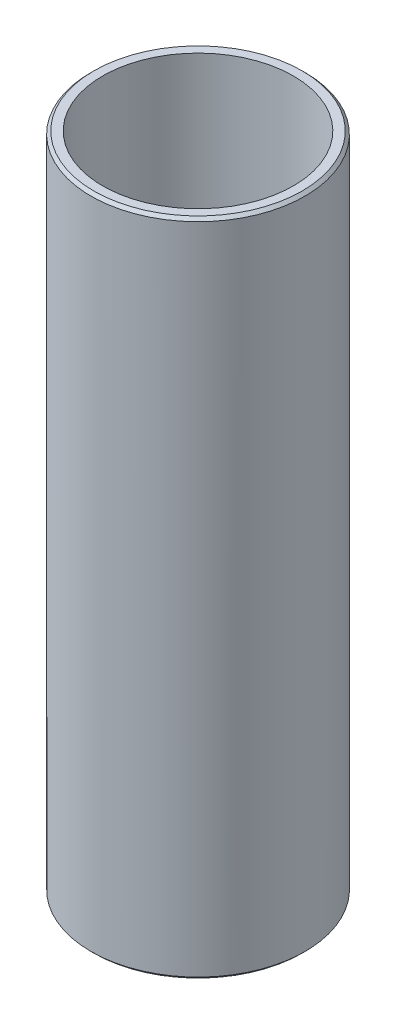
ISO-10303-21;
HEADER;
FILE_DESCRIPTION(('STEP AP214'),'2;1');
FILE_NAME('part.step','',(''),(''),'','','');
FILE_SCHEMA(('AUTOMOTIVE_DESIGN { 1 0 10303 214 1 1 1 1 }'));
ENDSEC;
DATA;
#1=APPLICATION_CONTEXT('core data for automotive mechanical design processes');
#2=APPLICATION_PROTOCOL_DEFINITION('international standard','automotive_design',2000,#1);
#3=PRODUCT_CONTEXT('',#1,'mechanical');
#4=PRODUCT('Part','Part','',(#3));
#5=PRODUCT_RELATED_PRODUCT_CATEGORY('part','',(#4));
#6=PRODUCT_DEFINITION_FORMATION('','',#4);
#7=PRODUCT_DEFINITION_CONTEXT('part definition',#1,'design');
#8=PRODUCT_DEFINITION('design','',#6,#7);
#9=PRODUCT_DEFINITION_SHAPE('','',#8);
#10=(LENGTH_UNIT() NAMED_UNIT(*) SI_UNIT(.MILLI.,.METRE.));
#11=(NAMED_UNIT(*) PLANE_ANGLE_UNIT() SI_UNIT($,.RADIAN.));
#12=(NAMED_UNIT(*) SI_UNIT($,.STERADIAN.) SOLID_ANGLE_UNIT());
#13=UNCERTAINTY_MEASURE_WITH_UNIT(LENGTH_MEASURE(1.E-05),#10,'distance_accuracy_value','');
#14=(GEOMETRIC_REPRESENTATION_CONTEXT(3) GLOBAL_UNCERTAINTY_ASSIGNED_CONTEXT((#13)) GLOBAL_UNIT_ASSIGNED_CONTEXT((#10,
#11,#12)) REPRESENTATION_CONTEXT('',''));
#15=CARTESIAN_POINT('',(0.,0.,0.));
#16=DIRECTION('',(0.,0.,1.));
#17=DIRECTION('',(1.,0.,0.));
#18=AXIS2_PLACEMENT_3D('',#15,#16,#17);
#19=CARTESIAN_POINT('',(0.,45.,0.));
#20=DIRECTION('',(0.,1.,0.));
#21=DIRECTION('',(0.,0.,1.));
#22=AXIS2_PLACEMENT_3D('',#19,#20,#21);
#23=PLANE('',#22);
#24=CARTESIAN_POINT('',(0.,45.,0.));
#25=DIRECTION('',(0.,1.,0.));
#26=DIRECTION('',(0.,0.,1.));
#27=AXIS2_PLACEMENT_3D('',#24,#25,#26);
#28=CIRCLE('',#27,7.10000000000002);
#29=CARTESIAN_POINT('',(0.,45.,-7.10000000000003));
#30=VERTEX_POINT('',#29);
#31=EDGE_CURVE('E53',#30,#30,#28,.T.);
#32=ORIENTED_EDGE('',*,*,#31,.T.);
#33=EDGE_LOOP('',(#32));
#34=FACE_BOUND('',#33,.T.);
#35=CARTESIAN_POINT('',(0.,45.,0.));
#36=DIRECTION('',(0.,1.,0.));
#37=DIRECTION('',(0.,0.,1.));
#38=AXIS2_PLACEMENT_3D('',#35,#36,#37);
#39=CIRCLE('',#38,6.5);
#40=CARTESIAN_POINT('',(0.,45.,-6.5));
#41=VERTEX_POINT('',#40);
#42=EDGE_CURVE('E58',#41,#41,#39,.T.);
#43=ORIENTED_EDGE('',*,*,#42,.F.);
#44=EDGE_LOOP('',(#43));
#45=FACE_BOUND('',#44,.T.);
#46=ADVANCED_FACE('F37',(#34,#45),#23,.T.);
#47=CARTESIAN_POINT('',(0.,0.,0.));
#48=DIRECTION('',(0.,1.,0.));
#49=DIRECTION('',(0.,0.,1.));
#50=AXIS2_PLACEMENT_3D('',#47,#48,#49);
#51=PLANE('',#50);
#52=CARTESIAN_POINT('',(0.,0.,0.));
#53=DIRECTION('',(0.,1.,0.));
#54=DIRECTION('',(0.,0.,1.));
#55=AXIS2_PLACEMENT_3D('',#52,#53,#54);
#56=CIRCLE('',#55,7.09999999999997);
#57=CARTESIAN_POINT('',(0.,0.,7.09999999999997));
#58=VERTEX_POINT('',#57);
#59=EDGE_CURVE('E10',#58,#58,#56,.F.);
#60=ORIENTED_EDGE('',*,*,#59,.T.);
#61=EDGE_LOOP('',(#60));
#62=FACE_BOUND('',#61,.T.);
#63=CARTESIAN_POINT('',(0.,0.,0.));
#64=DIRECTION('',(0.,1.,0.));
#65=DIRECTION('',(0.,0.,1.));
#66=AXIS2_PLACEMENT_3D('',#63,#64,#65);
#67=CIRCLE('',#66,6.5);
#68=CARTESIAN_POINT('',(0.,0.,-6.5));
#69=VERTEX_POINT('',#68);
#70=EDGE_CURVE('E59',#69,#69,#67,.T.);
#71=ORIENTED_EDGE('',*,*,#70,.T.);
#72=EDGE_LOOP('',(#71));
#73=FACE_BOUND('',#72,.T.);
#74=ADVANCED_FACE('F69',(#62,#73),#51,.F.);
#75=CARTESIAN_POINT('',(0.,45.,0.));
#76=DIRECTION('',(0.,-1.,0.));
#77=DIRECTION('',(0.,0.,-1.));
#78=AXIS2_PLACEMENT_3D('',#75,#76,#77);
#79=CYLINDRICAL_SURFACE('',#78,7.3);
#80=CARTESIAN_POINT('',(0.,44.8,0.));
#81=DIRECTION('',(0.,1.,0.));
#82=DIRECTION('',(0.,0.,1.));
#83=AXIS2_PLACEMENT_3D('',#80,#81,#82);
#84=CIRCLE('',#83,7.3);
#85=CARTESIAN_POINT('',(0.,44.8,-7.3));
#86=VERTEX_POINT('',#85);
#87=EDGE_CURVE('E45',#86,#86,#84,.F.);
#88=CARTESIAN_POINT('',(0.,0.200000000000033,0.));
#89=DIRECTION('',(0.,1.,0.));
#90=DIRECTION('',(0.,0.,1.));
#91=AXIS2_PLACEMENT_3D('',#88,#89,#90);
#92=CIRCLE('',#91,7.3);
#93=CARTESIAN_POINT('',(0.,0.200000000000027,-7.3));
#94=VERTEX_POINT('',#93);
#95=EDGE_CURVE('E49',#94,#94,#92,.T.);
#96=CARTESIAN_POINT('',(0.,44.8,-7.3));
#97=CARTESIAN_POINT('',(0.,44.3354166666667,-7.3));
#98=CARTESIAN_POINT('',(0.,43.8708333333333,-7.3));
#99=CARTESIAN_POINT('',(0.,42.9416666666667,-7.3));
#100=CARTESIAN_POINT('',(0.,42.4770833333333,-7.3));
#101=CARTESIAN_POINT('',(0.,41.5479166666667,-7.3));
#102=CARTESIAN_POINT('',(0.,41.0833333333333,-7.3));
#103=CARTESIAN_POINT('',(0.,40.1541666666667,-7.3));
#104=CARTESIAN_POINT('',(0.,39.6895833333333,-7.3));
#105=CARTESIAN_POINT('',(0.,38.7604166666667,-7.3));
#106=CARTESIAN_POINT('',(0.,38.2958333333333,-7.3));
#107=CARTESIAN_POINT('',(0.,37.3666666666667,-7.3));
#108=CARTESIAN_POINT('',(0.,36.9020833333334,-7.3));
#109=CARTESIAN_POINT('',(0.,35.9729166666667,-7.3));
#110=CARTESIAN_POINT('',(0.,35.5083333333333,-7.3));
#111=CARTESIAN_POINT('',(0.,34.5791666666667,-7.3));
#112=CARTESIAN_POINT('',(0.,34.1145833333333,-7.3));
#113=CARTESIAN_POINT('',(0.,33.1854166666667,-7.3));
#114=CARTESIAN_POINT('',(0.,32.7208333333334,-7.3));
#115=CARTESIAN_POINT('',(0.,31.7916666666667,-7.3));
#116=CARTESIAN_POINT('',(0.,31.3270833333334,-7.3));
#117=CARTESIAN_POINT('',(0.,30.3979166666667,-7.3));
#118=CARTESIAN_POINT('',(0.,29.9333333333334,-7.3));
#119=CARTESIAN_POINT('',(0.,29.0041666666667,-7.3));
#120=CARTESIAN_POINT('',(0.,28.5395833333334,-7.3));
#121=CARTESIAN_POINT('',(0.,27.6104166666667,-7.3));
#122=CARTESIAN_POINT('',(0.,27.1458333333334,-7.3));
#123=CARTESIAN_POINT('',(0.,26.2166666666667,-7.3));
#124=CARTESIAN_POINT('',(0.,25.7520833333334,-7.3));
#125=CARTESIAN_POINT('',(0.,24.8229166666667,-7.3));
#126=CARTESIAN_POINT('',(0.,24.3583333333334,-7.3));
#127=CARTESIAN_POINT('',(0.,23.4291666666667,-7.3));
#128=CARTESIAN_POINT('',(0.,22.9645833333334,-7.3));
#129=CARTESIAN_POINT('',(0.,22.0354166666667,-7.3));
#130=CARTESIAN_POINT('',(0.,21.5708333333334,-7.3));
#131=CARTESIAN_POINT('',(0.,20.6416666666667,-7.3));
#132=CARTESIAN_POINT('',(0.,20.1770833333334,-7.3));
#133=CARTESIAN_POINT('',(0.,19.2479166666667,-7.3));
#134=CARTESIAN_POINT('',(0.,18.7833333333334,-7.3));
#135=CARTESIAN_POINT('',(0.,17.8541666666667,-7.3));
#136=CARTESIAN_POINT('',(0.,17.3895833333334,-7.3));
#137=CARTESIAN_POINT('',(0.,16.4604166666667,-7.3));
#138=CARTESIAN_POINT('',(0.,15.9958333333334,-7.3));
#139=CARTESIAN_POINT('',(0.,15.0666666666667,-7.3));
#140=CARTESIAN_POINT('',(0.,14.6020833333334,-7.3));
#141=CARTESIAN_POINT('',(0.,13.6729166666667,-7.3));
#142=CARTESIAN_POINT('',(0.,13.2083333333334,-7.3));
#143=CARTESIAN_POINT('',(0.,12.2791666666667,-7.3));
#144=CARTESIAN_POINT('',(0.,11.8145833333334,-7.3));
#145=CARTESIAN_POINT('',(0.,10.8854166666667,-7.3));
#146=CARTESIAN_POINT('',(0.,10.4208333333334,-7.3));
#147=CARTESIAN_POINT('',(0.,9.4916666666667,-7.3));
#148=CARTESIAN_POINT('',(0.,9.02708333333336,-7.3));
#149=CARTESIAN_POINT('',(0.,8.09791666666669,-7.3));
#150=CARTESIAN_POINT('',(0.,7.63333333333336,-7.3));
#151=CARTESIAN_POINT('',(0.,6.70416666666669,-7.3));
#152=CARTESIAN_POINT('',(0.,6.23958333333336,-7.3));
#153=CARTESIAN_POINT('',(0.,5.31041666666669,-7.3));
#154=CARTESIAN_POINT('',(0.,4.84583333333336,-7.3));
#155=CARTESIAN_POINT('',(0.,3.91666666666669,-7.3));
#156=CARTESIAN_POINT('',(0.,3.45208333333336,-7.3));
#157=CARTESIAN_POINT('',(0.,2.52291666666669,-7.3));
#158=CARTESIAN_POINT('',(0.,2.05833333333336,-7.3));
#159=CARTESIAN_POINT('',(0.,1.12916666666669,-7.3));
#160=CARTESIAN_POINT('',(0.,0.664583333333359,-7.3));
#161=CARTESIAN_POINT('',(0.,0.200000000000027,-7.3));
#162=B_SPLINE_CURVE_WITH_KNOTS('',3,(#96,#97,#98,#99,#100,#101,#102,#103,#104,#105,#106,#107,
#108,#109,#110,#111,#112,#113,#114,#115,#116,#117,#118,#119,#120,#121,#122,#123,#124,#125,#126,
#127,#128,#129,#130,#131,#132,#133,#134,#135,#136,#137,#138,#139,#140,#141,#142,#143,#144,#145,
#146,#147,#148,#149,#150,#151,#152,#153,#154,#155,#156,#157,#158,#159,#160,#161),.UNSPECIFIED.,
.F.,.F.,(4,2,2,2,2,2,2,2,2,2,2,2,2,2,2,2,2,2,2,2,2,2,2,2,2,2,2,2,2,2,2,2,4),(0.,1.39375,2.7875,
4.18125,5.575,6.96875,8.3625,9.75624999999999,11.15,12.54375,13.9375,15.33125,16.725,18.11875,
19.5125,20.90625,22.3,23.69375,25.0875,26.48125,27.875,29.26875,30.6625,32.05625,33.45,34.84375,
36.2375,37.63125,39.025,40.41875,41.8125,43.20625,44.6),.UNSPECIFIED.);
#163=EDGE_CURVE('BSEAM75',#86,#94,#162,.T.);
#164=ORIENTED_EDGE('',*,*,#87,.T.);
#165=ORIENTED_EDGE('',*,*,#95,.T.);
#166=ORIENTED_EDGE('',*,*,#163,.T.);
#167=ORIENTED_EDGE('',*,*,#163,.F.);
#168=EDGE_LOOP('',(#164,#166,#165,#167));
#169=FACE_BOUND('',#168,.T.);
#170=ADVANCED_FACE('F75',(#169),#79,.T.);
#171=CARTESIAN_POINT('',(0.,45.,0.));
#172=DIRECTION('',(0.,-1.,0.));
#173=DIRECTION('',(0.,0.,-1.));
#174=AXIS2_PLACEMENT_3D('',#171,#172,#173);
#175=CYLINDRICAL_SURFACE('',#174,6.5);
#176=CARTESIAN_POINT('',(0.,45.,-6.5));
#177=CARTESIAN_POINT('',(0.,44.53125,-6.5));
#178=CARTESIAN_POINT('',(0.,44.0625,-6.5));
#179=CARTESIAN_POINT('',(0.,43.125,-6.5));
#180=CARTESIAN_POINT('',(0.,42.65625,-6.5));
#181=CARTESIAN_POINT('',(0.,41.71875,-6.5));
#182=CARTESIAN_POINT('',(0.,41.25,-6.5));
#183=CARTESIAN_POINT('',(0.,40.3125,-6.5));
#184=CARTESIAN_POINT('',(0.,39.84375,-6.5));
#185=CARTESIAN_POINT('',(0.,38.90625,-6.5));
#186=CARTESIAN_POINT('',(0.,38.4375,-6.5));
#187=CARTESIAN_POINT('',(0.,37.5,-6.5));
#188=CARTESIAN_POINT('',(0.,37.03125,-6.5));
#189=CARTESIAN_POINT('',(0.,36.09375,-6.5));
#190=CARTESIAN_POINT('',(0.,35.625,-6.5));
#191=CARTESIAN_POINT('',(0.,34.6875,-6.5));
#192=CARTESIAN_POINT('',(0.,34.21875,-6.5));
#193=CARTESIAN_POINT('',(0.,33.28125,-6.5));
#194=CARTESIAN_POINT('',(0.,32.8125,-6.5));
#195=CARTESIAN_POINT('',(0.,31.875,-6.5));
#196=CARTESIAN_POINT('',(0.,31.40625,-6.5));
#197=CARTESIAN_POINT('',(0.,30.46875,-6.5));
#198=CARTESIAN_POINT('',(0.,30.,-6.5));
#199=CARTESIAN_POINT('',(0.,29.0625,-6.5));
#200=CARTESIAN_POINT('',(0.,28.59375,-6.5));
#201=CARTESIAN_POINT('',(0.,27.65625,-6.5));
#202=CARTESIAN_POINT('',(0.,27.1875,-6.5));
#203=CARTESIAN_POINT('',(0.,26.25,-6.5));
#204=CARTESIAN_POINT('',(0.,25.78125,-6.5));
#205=CARTESIAN_POINT('',(0.,24.84375,-6.5));
#206=CARTESIAN_POINT('',(0.,24.375,-6.5));
#207=CARTESIAN_POINT('',(0.,23.4375,-6.5));
#208=CARTESIAN_POINT('',(0.,22.96875,-6.5));
#209=CARTESIAN_POINT('',(0.,22.03125,-6.5));
#210=CARTESIAN_POINT('',(0.,21.5625,-6.5));
#211=CARTESIAN_POINT('',(0.,20.625,-6.5));
#212=CARTESIAN_POINT('',(0.,20.15625,-6.5));
#213=CARTESIAN_POINT('',(0.,19.21875,-6.5));
#214=CARTESIAN_POINT('',(0.,18.75,-6.5));
#215=CARTESIAN_POINT('',(0.,17.8125,-6.5));
#216=CARTESIAN_POINT('',(0.,17.34375,-6.5));
#217=CARTESIAN_POINT('',(0.,16.40625,-6.5));
#218=CARTESIAN_POINT('',(0.,15.9375,-6.5));
#219=CARTESIAN_POINT('',(0.,15.,-6.5));
#220=CARTESIAN_POINT('',(0.,14.53125,-6.5));
#221=CARTESIAN_POINT('',(0.,13.59375,-6.5));
#222=CARTESIAN_POINT('',(0.,13.125,-6.5));
#223=CARTESIAN_POINT('',(0.,12.1875,-6.5));
#224=CARTESIAN_POINT('',(0.,11.71875,-6.5));
#225=CARTESIAN_POINT('',(0.,10.78125,-6.5));
#226=CARTESIAN_POINT('',(0.,10.3125,-6.5));
#227=CARTESIAN_POINT('',(0.,9.37499999999999,-6.5));
#228=CARTESIAN_POINT('',(0.,8.90624999999999,-6.5));
#229=CARTESIAN_POINT('',(0.,7.96874999999999,-6.5));
#230=CARTESIAN_POINT('',(0.,7.5,-6.5));
#231=CARTESIAN_POINT('',(0.,6.56249999999999,-6.5));
#232=CARTESIAN_POINT('',(0.,6.09374999999999,-6.5));
#233=CARTESIAN_POINT('',(0.,5.15624999999999,-6.5));
#234=CARTESIAN_POINT('',(0.,4.68749999999999,-6.5));
#235=CARTESIAN_POINT('',(0.,3.74999999999999,-6.5));
#236=CARTESIAN_POINT('',(0.,3.28124999999999,-6.5));
#237=CARTESIAN_POINT('',(0.,2.34374999999999,-6.5));
#238=CARTESIAN_POINT('',(0.,1.87499999999999,-6.5));
#239=CARTESIAN_POINT('',(0.,0.937499999999992,-6.5));
#240=CARTESIAN_POINT('',(0.,0.468749999999993,-6.5));
#241=CARTESIAN_POINT('',(0.,0.,-6.5));
#242=B_SPLINE_CURVE_WITH_KNOTS('',3,(#176,#177,#178,#179,#180,#181,#182,#183,#184,#185,#186,
#187,#188,#189,#190,#191,#192,#193,#194,#195,#196,#197,#198,#199,#200,#201,#202,#203,#204,#205,
#206,#207,#208,#209,#210,#211,#212,#213,#214,#215,#216,#217,#218,#219,#220,#221,#222,#223,#224,
#225,#226,#227,#228,#229,#230,#231,#232,#233,#234,#235,#236,#237,#238,#239,#240,#241),
.UNSPECIFIED.,.F.,.F.,(4,2,2,2,2,2,2,2,2,2,2,2,2,2,2,2,2,2,2,2,2,2,2,2,2,2,2,2,2,2,2,2,4),(0.,
1.40625,2.8125,4.21874999999999,5.625,7.03125,8.43749999999999,9.84375,11.25,12.65625,14.0625,
15.46875,16.875,18.28125,19.6875,21.09375,22.5,23.90625,25.3125,26.71875,28.125,29.53125,
30.9375,32.34375,33.75,35.15625,36.5625,37.96875,39.375,40.78125,42.1875,43.59375,45.),.UNSPECIFIED.);
#243=EDGE_CURVE('BSEAM65',#41,#69,#242,.T.);
#244=ORIENTED_EDGE('',*,*,#42,.T.);
#245=ORIENTED_EDGE('',*,*,#70,.F.);
#246=ORIENTED_EDGE('',*,*,#243,.T.);
#247=ORIENTED_EDGE('',*,*,#243,.F.);
#248=EDGE_LOOP('',(#244,#246,#245,#247));
#249=FACE_BOUND('',#248,.T.);
#250=ADVANCED_FACE('F65',(#249),#175,.F.);
#251=CARTESIAN_POINT('',(0.,45.,0.));
#252=DIRECTION('',(0.,-1.,0.));
#253=DIRECTION('',(0.,0.,-1.));
#254=AXIS2_PLACEMENT_3D('',#251,#252,#253);
#255=CONICAL_SURFACE('',#254,7.10000000000002,0.785398163397448);
#256=CARTESIAN_POINT('',(0.,44.8,-7.3));
#257=CARTESIAN_POINT('',(0.,44.8020833333333,-7.29791666666667));
#258=CARTESIAN_POINT('',(0.,44.8041666666667,-7.29583333333334));
#259=CARTESIAN_POINT('',(0.,44.8083333333333,-7.29166666666667));
#260=CARTESIAN_POINT('',(0.,44.8104166666667,-7.28958333333334));
#261=CARTESIAN_POINT('',(0.,44.8145833333333,-7.28541666666667));
#262=CARTESIAN_POINT('',(0.,44.8166666666667,-7.28333333333334));
#263=CARTESIAN_POINT('',(0.,44.8208333333333,-7.27916666666667));
#264=CARTESIAN_POINT('',(0.,44.8229166666667,-7.27708333333334));
#265=CARTESIAN_POINT('',(0.,44.8270833333333,-7.27291666666667));
#266=CARTESIAN_POINT('',(0.,44.8291666666667,-7.27083333333334));
#267=CARTESIAN_POINT('',(0.,44.8333333333333,-7.26666666666667));
#268=CARTESIAN_POINT('',(0.,44.8354166666667,-7.26458333333334));
#269=CARTESIAN_POINT('',(0.,44.8395833333333,-7.26041666666667));
#270=CARTESIAN_POINT('',(0.,44.8416666666667,-7.25833333333334));
#271=CARTESIAN_POINT('',(0.,44.8458333333333,-7.25416666666668));
#272=CARTESIAN_POINT('',(0.,44.8479166666667,-7.25208333333334));
#273=CARTESIAN_POINT('',(0.,44.8520833333333,-7.24791666666668));
#274=CARTESIAN_POINT('',(0.,44.8541666666667,-7.24583333333334));
#275=CARTESIAN_POINT('',(0.,44.8583333333333,-7.24166666666668));
#276=CARTESIAN_POINT('',(0.,44.8604166666667,-7.23958333333334));
#277=CARTESIAN_POINT('',(0.,44.8645833333333,-7.23541666666668));
#278=CARTESIAN_POINT('',(0.,44.8666666666667,-7.23333333333334));
#279=CARTESIAN_POINT('',(0.,44.8708333333333,-7.22916666666668));
#280=CARTESIAN_POINT('',(0.,44.8729166666667,-7.22708333333335));
#281=CARTESIAN_POINT('',(0.,44.8770833333333,-7.22291666666668));
#282=CARTESIAN_POINT('',(0.,44.8791666666667,-7.22083333333335));
#283=CARTESIAN_POINT('',(0.,44.8833333333333,-7.21666666666668));
#284=CARTESIAN_POINT('',(0.,44.8854166666667,-7.21458333333335));
#285=CARTESIAN_POINT('',(0.,44.8895833333333,-7.21041666666668));
#286=CARTESIAN_POINT('',(0.,44.8916666666667,-7.20833333333335));
#287=CARTESIAN_POINT('',(0.,44.8958333333333,-7.20416666666668));
#288=CARTESIAN_POINT('',(0.,44.8979166666667,-7.20208333333335));
#289=CARTESIAN_POINT('',(0.,44.9020833333333,-7.19791666666668));
#290=CARTESIAN_POINT('',(0.,44.9041666666667,-7.19583333333335));
#291=CARTESIAN_POINT('',(0.,44.9083333333333,-7.19166666666668));
#292=CARTESIAN_POINT('',(0.,44.9104166666667,-7.18958333333335));
#293=CARTESIAN_POINT('',(0.,44.9145833333333,-7.18541666666668));
#294=CARTESIAN_POINT('',(0.,44.9166666666667,-7.18333333333335));
#295=CARTESIAN_POINT('',(0.,44.9208333333333,-7.17916666666668));
#296=CARTESIAN_POINT('',(0.,44.9229166666667,-7.17708333333335));
#297=CARTESIAN_POINT('',(0.,44.9270833333333,-7.17291666666668));
#298=CARTESIAN_POINT('',(0.,44.9291666666667,-7.17083333333335));
#299=CARTESIAN_POINT('',(0.,44.9333333333333,-7.16666666666668));
#300=CARTESIAN_POINT('',(0.,44.9354166666667,-7.16458333333335));
#301=CARTESIAN_POINT('',(0.,44.9395833333333,-7.16041666666669));
#302=CARTESIAN_POINT('',(0.,44.9416666666667,-7.15833333333335));
#303=CARTESIAN_POINT('',(0.,44.9458333333333,-7.15416666666669));
#304=CARTESIAN_POINT('',(0.,44.9479166666667,-7.15208333333335));
#305=CARTESIAN_POINT('',(0.,44.9520833333333,-7.14791666666669));
#306=CARTESIAN_POINT('',(0.,44.9541666666667,-7.14583333333335));
#307=CARTESIAN_POINT('',(0.,44.9583333333333,-7.14166666666669));
#308=CARTESIAN_POINT('',(0.,44.9604166666667,-7.13958333333335));
#309=CARTESIAN_POINT('',(0.,44.9645833333333,-7.13541666666669));
#310=CARTESIAN_POINT('',(0.,44.9666666666667,-7.13333333333336));
#311=CARTESIAN_POINT('',(0.,44.9708333333333,-7.12916666666669));
#312=CARTESIAN_POINT('',(0.,44.9729166666667,-7.12708333333336));
#313=CARTESIAN_POINT('',(0.,44.9770833333333,-7.12291666666669));
#314=CARTESIAN_POINT('',(0.,44.9791666666667,-7.12083333333336));
#315=CARTESIAN_POINT('',(0.,44.9833333333333,-7.11666666666669));
#316=CARTESIAN_POINT('',(0.,44.9854166666667,-7.11458333333336));
#317=CARTESIAN_POINT('',(0.,44.9895833333333,-7.11041666666669));
#318=CARTESIAN_POINT('',(0.,44.9916666666667,-7.10833333333336));
#319=CARTESIAN_POINT('',(0.,44.9958333333333,-7.10416666666669));
#320=CARTESIAN_POINT('',(0.,44.9979166666667,-7.10208333333336));
#321=CARTESIAN_POINT('',(0.,45.,-7.10000000000003));
#322=B_SPLINE_CURVE_WITH_KNOTS('',3,(#256,#257,#258,#259,#260,#261,#262,#263,#264,#265,#266,
#267,#268,#269,#270,#271,#272,#273,#274,#275,#276,#277,#278,#279,#280,#281,#282,#283,#284,#285,
#286,#287,#288,#289,#290,#291,#292,#293,#294,#295,#296,#297,#298,#299,#300,#301,#302,#303,#304,
#305,#306,#307,#308,#309,#310,#311,#312,#313,#314,#315,#316,#317,#318,#319,#320,#321),
.UNSPECIFIED.,.F.,.F.,(4,2,2,2,2,2,2,2,2,2,2,2,2,2,2,2,2,2,2,2,2,2,2,2,2,2,2,2,2,2,2,2,4),(0.,
0.00883883476483087,0.0176776695296617,0.0265165042944926,0.0353553390593235,0.0441941738241543,
0.0530330085889852,0.0618718433538161,0.070710678118647,0.0795495128834778,0.0883883476483087,
0.0972271824131395,0.106066017177975,0.114904851942801,0.123743686707632,0.132582521472463,
0.141421356237294,0.150260191002125,0.159099025766956,0.167937860531787,0.176776695296617,
0.185615530061448,0.194454364826279,0.20329319959111,0.212132034355946,0.220970869120777,
0.229809703885608,0.238648538650439,0.247487373415269,0.2563262081801,0.265165042944931,
0.274003877709762,0.282842712474593),.UNSPECIFIED.);
#323=EDGE_CURVE('BSEAM81',#86,#30,#322,.T.);
#324=ORIENTED_EDGE('',*,*,#87,.F.);
#325=ORIENTED_EDGE('',*,*,#31,.F.);
#326=ORIENTED_EDGE('',*,*,#323,.T.);
#327=ORIENTED_EDGE('',*,*,#323,.F.);
#328=EDGE_LOOP('',(#324,#326,#325,#327));
#329=FACE_BOUND('',#328,.T.);
#330=ADVANCED_FACE('F81',(#329),#255,.T.);
#331=CARTESIAN_POINT('',(0.,0.200000000000027,0.));
#332=DIRECTION('',(0.,1.,0.));
#333=DIRECTION('',(0.,0.,1.));
#334=AXIS2_PLACEMENT_3D('',#331,#332,#333);
#335=CONICAL_SURFACE('',#334,7.3,0.785398163397457);
#336=ORIENTED_EDGE('',*,*,#59,.F.);
#337=EDGE_LOOP('',(#336));
#338=FACE_BOUND('',#337,.T.);
#339=ORIENTED_EDGE('',*,*,#95,.F.);
#340=EDGE_LOOP('',(#339));
#341=FACE_BOUND('',#340,.T.);
#342=ADVANCED_FACE('F40',(#338,#341),#335,.T.);
#343=CLOSED_SHELL('',(#46,#74,#170,#250,#330,#342));
#344=MANIFOLD_SOLID_BREP('B2',#343);
#345=ADVANCED_BREP_SHAPE_REPRESENTATION('',(#18,#344),#14);
#346=SHAPE_DEFINITION_REPRESENTATION(#9,#345);
ENDSEC;
END-ISO-10303-21;
